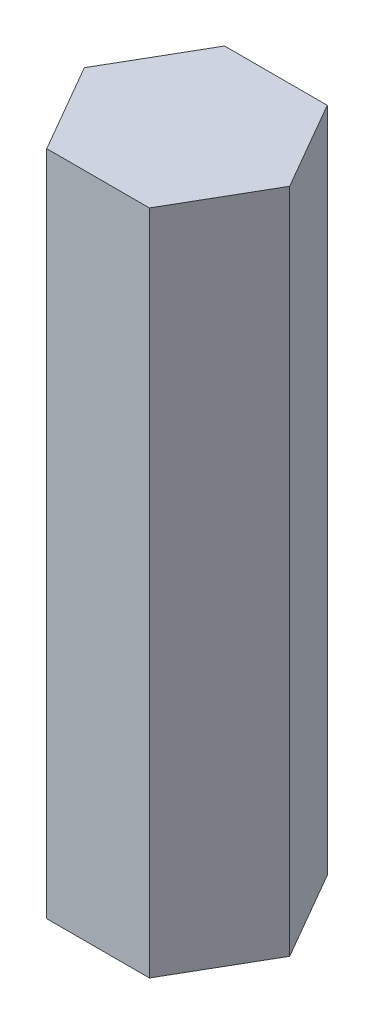
ISO-10303-21;
HEADER;
FILE_DESCRIPTION(('STEP AP214'),'2;1');
FILE_NAME('part.step','',(''),(''),'','','');
FILE_SCHEMA(('AUTOMOTIVE_DESIGN { 1 0 10303 214 1 1 1 1 }'));
ENDSEC;
DATA;
#1=APPLICATION_CONTEXT('core data for automotive mechanical design processes');
#2=APPLICATION_PROTOCOL_DEFINITION('international standard','automotive_design',2000,#1);
#3=PRODUCT_CONTEXT('',#1,'mechanical');
#4=PRODUCT('Part','Part','',(#3));
#5=PRODUCT_RELATED_PRODUCT_CATEGORY('part','',(#4));
#6=PRODUCT_DEFINITION_FORMATION('','',#4);
#7=PRODUCT_DEFINITION_CONTEXT('part definition',#1,'design');
#8=PRODUCT_DEFINITION('design','',#6,#7);
#9=PRODUCT_DEFINITION_SHAPE('','',#8);
#10=(LENGTH_UNIT() NAMED_UNIT(*) SI_UNIT(.MILLI.,.METRE.));
#11=(NAMED_UNIT(*) PLANE_ANGLE_UNIT() SI_UNIT($,.RADIAN.));
#12=(NAMED_UNIT(*) SI_UNIT($,.STERADIAN.) SOLID_ANGLE_UNIT());
#13=UNCERTAINTY_MEASURE_WITH_UNIT(LENGTH_MEASURE(1.E-05),#10,'distance_accuracy_value','');
#14=(GEOMETRIC_REPRESENTATION_CONTEXT(3) GLOBAL_UNCERTAINTY_ASSIGNED_CONTEXT((#13)) GLOBAL_UNIT_ASSIGNED_CONTEXT((#10,
#11,#12)) REPRESENTATION_CONTEXT('',''));
#15=CARTESIAN_POINT('',(0.,0.,0.));
#16=DIRECTION('',(0.,0.,1.));
#17=DIRECTION('',(1.,0.,0.));
#18=AXIS2_PLACEMENT_3D('',#15,#16,#17);
#19=CARTESIAN_POINT('',(-7.3323484187084,47.625,-12.6999999999999));
#20=DIRECTION('',(0.866025403784441,0.,0.499999999999995));
#21=DIRECTION('',(0.499999999999995,0.,-0.866025403784442));
#22=AXIS2_PLACEMENT_3D('',#19,#20,#21);
#23=PLANE('',#22);
#24=DIRECTION('',(-0.499999999999995,0.,0.866025403784442));
#25=VECTOR('',#24,1.);
#26=CARTESIAN_POINT('',(-7.3323484187084,-47.625,-12.6999999999999));
#27=LINE('',#26,#25);
#28=CARTESIAN_POINT('',(-7.3323484187084,-47.625,-12.6999999999999));
#29=VERTEX_POINT('',#28);
#30=CARTESIAN_POINT('',(-14.6646968374165,-47.625,0.));
#31=VERTEX_POINT('',#30);
#32=EDGE_CURVE('E122',#29,#31,#27,.T.);
#33=ORIENTED_EDGE('',*,*,#32,.T.);
#34=DIRECTION('',(0.,-1.,0.));
#35=VECTOR('',#34,1.);
#36=CARTESIAN_POINT('',(-14.6646968374165,47.625,0.));
#37=LINE('',#36,#35);
#38=CARTESIAN_POINT('',(-14.6646968374165,47.625,0.));
#39=VERTEX_POINT('',#38);
#40=EDGE_CURVE('E11',#39,#31,#37,.T.);
#41=ORIENTED_EDGE('',*,*,#40,.F.);
#42=DIRECTION('',(-0.499999999999995,0.,0.866025403784442));
#43=VECTOR('',#42,1.);
#44=CARTESIAN_POINT('',(-7.3323484187084,47.625,-12.6999999999999));
#45=LINE('',#44,#43);
#46=CARTESIAN_POINT('',(-7.3323484187084,47.625,-12.6999999999999));
#47=VERTEX_POINT('',#46);
#48=EDGE_CURVE('E132',#47,#39,#45,.T.);
#49=ORIENTED_EDGE('',*,*,#48,.F.);
#50=DIRECTION('',(0.,-1.,0.));
#51=VECTOR('',#50,1.);
#52=CARTESIAN_POINT('',(-7.3323484187084,47.625,-12.6999999999999));
#53=LINE('',#52,#51);
#54=EDGE_CURVE('E118',#47,#29,#53,.T.);
#55=ORIENTED_EDGE('',*,*,#54,.T.);
#56=EDGE_LOOP('',(#33,#41,#49,#55));
#57=FACE_BOUND('',#56,.T.);
#58=ADVANCED_FACE('F38',(#57),#23,.F.);
#59=CARTESIAN_POINT('',(-14.6646968374165,47.625,0.));
#60=DIRECTION('',(0.866025403784438,0.,-0.500000000000001));
#61=DIRECTION('',(-0.500000000000001,0.,-0.866025403784438));
#62=AXIS2_PLACEMENT_3D('',#59,#60,#61);
#63=PLANE('',#62);
#64=DIRECTION('',(0.500000000000001,0.,0.866025403784438));
#65=VECTOR('',#64,1.);
#66=CARTESIAN_POINT('',(-14.6646968374165,-47.625,0.));
#67=LINE('',#66,#65);
#68=CARTESIAN_POINT('',(-7.33234841870822,-47.625,12.7));
#69=VERTEX_POINT('',#68);
#70=EDGE_CURVE('E125',#31,#69,#67,.T.);
#71=ORIENTED_EDGE('',*,*,#70,.T.);
#72=DIRECTION('',(0.,-1.,0.));
#73=VECTOR('',#72,1.);
#74=CARTESIAN_POINT('',(-7.33234841870822,47.625,12.7));
#75=LINE('',#74,#73);
#76=CARTESIAN_POINT('',(-7.33234841870822,47.625,12.7));
#77=VERTEX_POINT('',#76);
#78=EDGE_CURVE('E46',#77,#69,#75,.T.);
#79=ORIENTED_EDGE('',*,*,#78,.F.);
#80=DIRECTION('',(0.500000000000001,0.,0.866025403784438));
#81=VECTOR('',#80,1.);
#82=CARTESIAN_POINT('',(-14.6646968374165,47.625,0.));
#83=LINE('',#82,#81);
#84=EDGE_CURVE('E91',#39,#77,#83,.T.);
#85=ORIENTED_EDGE('',*,*,#84,.F.);
#86=ORIENTED_EDGE('',*,*,#40,.T.);
#87=EDGE_LOOP('',(#71,#79,#85,#86));
#88=FACE_BOUND('',#87,.T.);
#89=ADVANCED_FACE('F156',(#88),#63,.F.);
#90=CARTESIAN_POINT('',(-7.33234841870822,47.625,12.7));
#91=DIRECTION('',(0.,0.,-1.));
#92=DIRECTION('',(-1.,0.,0.));
#93=AXIS2_PLACEMENT_3D('',#90,#91,#92);
#94=PLANE('',#93);
#95=DIRECTION('',(1.,0.,0.));
#96=VECTOR('',#95,1.);
#97=CARTESIAN_POINT('',(-7.33234841870822,-47.625,12.7));
#98=LINE('',#97,#96);
#99=CARTESIAN_POINT('',(7.33234841870831,-47.625,12.7));
#100=VERTEX_POINT('',#99);
#101=EDGE_CURVE('E127',#69,#100,#98,.T.);
#102=ORIENTED_EDGE('',*,*,#101,.T.);
#103=DIRECTION('',(0.,-1.,0.));
#104=VECTOR('',#103,1.);
#105=CARTESIAN_POINT('',(7.33234841870831,47.625,12.7));
#106=LINE('',#105,#104);
#107=CARTESIAN_POINT('',(7.33234841870831,47.625,12.7));
#108=VERTEX_POINT('',#107);
#109=EDGE_CURVE('E113',#108,#100,#106,.T.);
#110=ORIENTED_EDGE('',*,*,#109,.F.);
#111=DIRECTION('',(1.,0.,0.));
#112=VECTOR('',#111,1.);
#113=CARTESIAN_POINT('',(-7.33234841870822,47.625,12.7));
#114=LINE('',#113,#112);
#115=EDGE_CURVE('E104',#77,#108,#114,.T.);
#116=ORIENTED_EDGE('',*,*,#115,.F.);
#117=ORIENTED_EDGE('',*,*,#78,.T.);
#118=EDGE_LOOP('',(#102,#110,#116,#117));
#119=FACE_BOUND('',#118,.T.);
#120=ADVANCED_FACE('F138',(#119),#94,.F.);
#121=CARTESIAN_POINT('',(7.33234841870831,47.625,12.7));
#122=DIRECTION('',(-0.866025403784442,0.,-0.499999999999995));
#123=DIRECTION('',(-0.499999999999995,0.,0.866025403784442));
#124=AXIS2_PLACEMENT_3D('',#121,#122,#123);
#125=PLANE('',#124);
#126=DIRECTION('',(0.499999999999995,0.,-0.866025403784442));
#127=VECTOR('',#126,1.);
#128=CARTESIAN_POINT('',(7.33234841870831,-47.625,12.7));
#129=LINE('',#128,#127);
#130=CARTESIAN_POINT('',(14.6646968374165,-47.625,-1.02403030695263E-13));
#131=VERTEX_POINT('',#130);
#132=EDGE_CURVE('E112',#100,#131,#129,.T.);
#133=ORIENTED_EDGE('',*,*,#132,.T.);
#134=DIRECTION('',(0.,-1.,0.));
#135=VECTOR('',#134,1.);
#136=CARTESIAN_POINT('',(14.6646968374165,47.625,-1.02403030695263E-13));
#137=LINE('',#136,#135);
#138=CARTESIAN_POINT('',(14.6646968374165,47.625,-1.02403030695263E-13));
#139=VERTEX_POINT('',#138);
#140=EDGE_CURVE('E109',#139,#131,#137,.T.);
#141=ORIENTED_EDGE('',*,*,#140,.F.);
#142=DIRECTION('',(0.499999999999995,0.,-0.866025403784442));
#143=VECTOR('',#142,1.);
#144=CARTESIAN_POINT('',(7.33234841870831,47.625,12.7));
#145=LINE('',#144,#143);
#146=EDGE_CURVE('E98',#108,#139,#145,.T.);
#147=ORIENTED_EDGE('',*,*,#146,.F.);
#148=ORIENTED_EDGE('',*,*,#109,.T.);
#149=EDGE_LOOP('',(#133,#141,#147,#148));
#150=FACE_BOUND('',#149,.T.);
#151=ADVANCED_FACE('F110',(#150),#125,.F.);
#152=CARTESIAN_POINT('',(14.6646968374165,47.625,-1.02403030695263E-13));
#153=DIRECTION('',(-0.866025403784435,0.,0.500000000000007));
#154=DIRECTION('',(0.500000000000007,0.,0.866025403784435));
#155=AXIS2_PLACEMENT_3D('',#152,#153,#154);
#156=PLANE('',#155);
#157=DIRECTION('',(-0.500000000000007,0.,-0.866025403784435));
#158=VECTOR('',#157,1.);
#159=CARTESIAN_POINT('',(14.6646968374165,-47.625,-1.02403030695263E-13));
#160=LINE('',#159,#158);
#161=CARTESIAN_POINT('',(7.33234841870813,-47.625,-12.7000000000001));
#162=VERTEX_POINT('',#161);
#163=EDGE_CURVE('E77',#131,#162,#160,.T.);
#164=ORIENTED_EDGE('',*,*,#163,.T.);
#165=DIRECTION('',(0.,-1.,0.));
#166=VECTOR('',#165,1.);
#167=CARTESIAN_POINT('',(7.33234841870813,47.625,-12.7000000000001));
#168=LINE('',#167,#166);
#169=CARTESIAN_POINT('',(7.33234841870813,47.625,-12.7000000000001));
#170=VERTEX_POINT('',#169);
#171=EDGE_CURVE('E114',#170,#162,#168,.T.);
#172=ORIENTED_EDGE('',*,*,#171,.F.);
#173=DIRECTION('',(-0.500000000000007,0.,-0.866025403784435));
#174=VECTOR('',#173,1.);
#175=CARTESIAN_POINT('',(14.6646968374165,47.625,-1.02403030695263E-13));
#176=LINE('',#175,#174);
#177=EDGE_CURVE('E102',#139,#170,#176,.T.);
#178=ORIENTED_EDGE('',*,*,#177,.F.);
#179=ORIENTED_EDGE('',*,*,#140,.T.);
#180=EDGE_LOOP('',(#164,#172,#178,#179));
#181=FACE_BOUND('',#180,.T.);
#182=ADVANCED_FACE('F116',(#181),#156,.F.);
#183=CARTESIAN_POINT('',(7.33234841870813,47.625,-12.7000000000001));
#184=DIRECTION('',(0.,0.,1.));
#185=DIRECTION('',(1.,0.,0.));
#186=AXIS2_PLACEMENT_3D('',#183,#184,#185);
#187=PLANE('',#186);
#188=DIRECTION('',(-1.,0.,0.));
#189=VECTOR('',#188,1.);
#190=CARTESIAN_POINT('',(7.33234841870813,-47.625,-12.7000000000001));
#191=LINE('',#190,#189);
#192=EDGE_CURVE('E83',#162,#29,#191,.T.);
#193=ORIENTED_EDGE('',*,*,#192,.T.);
#194=ORIENTED_EDGE('',*,*,#54,.F.);
#195=DIRECTION('',(-1.,0.,0.));
#196=VECTOR('',#195,1.);
#197=CARTESIAN_POINT('',(7.33234841870813,47.625,-12.7000000000001));
#198=LINE('',#197,#196);
#199=EDGE_CURVE('E54',#170,#47,#198,.T.);
#200=ORIENTED_EDGE('',*,*,#199,.F.);
#201=ORIENTED_EDGE('',*,*,#171,.T.);
#202=EDGE_LOOP('',(#193,#194,#200,#201));
#203=FACE_BOUND('',#202,.T.);
#204=ADVANCED_FACE('F145',(#203),#187,.F.);
#205=CARTESIAN_POINT('',(0.,47.625,0.));
#206=DIRECTION('',(0.,1.,0.));
#207=DIRECTION('',(0.,0.,1.));
#208=AXIS2_PLACEMENT_3D('',#205,#206,#207);
#209=PLANE('',#208);
#210=ORIENTED_EDGE('',*,*,#48,.T.);
#211=ORIENTED_EDGE('',*,*,#84,.T.);
#212=ORIENTED_EDGE('',*,*,#115,.T.);
#213=ORIENTED_EDGE('',*,*,#146,.T.);
#214=ORIENTED_EDGE('',*,*,#177,.T.);
#215=ORIENTED_EDGE('',*,*,#199,.T.);
#216=EDGE_LOOP('',(#210,#211,#212,#213,#214,#215));
#217=FACE_BOUND('',#216,.T.);
#218=ADVANCED_FACE('F100',(#217),#209,.T.);
#219=CARTESIAN_POINT('',(0.,-47.625,0.));
#220=DIRECTION('',(0.,1.,0.));
#221=DIRECTION('',(0.,0.,1.));
#222=AXIS2_PLACEMENT_3D('',#219,#220,#221);
#223=PLANE('',#222);
#224=ORIENTED_EDGE('',*,*,#32,.F.);
#225=ORIENTED_EDGE('',*,*,#192,.F.);
#226=ORIENTED_EDGE('',*,*,#163,.F.);
#227=ORIENTED_EDGE('',*,*,#132,.F.);
#228=ORIENTED_EDGE('',*,*,#101,.F.);
#229=ORIENTED_EDGE('',*,*,#70,.F.);
#230=EDGE_LOOP('',(#224,#225,#226,#227,#228,#229));
#231=FACE_BOUND('',#230,.T.);
#232=ADVANCED_FACE('F141',(#231),#223,.F.);
#233=CLOSED_SHELL('',(#58,#89,#120,#151,#182,#204,#218,#232));
#234=MANIFOLD_SOLID_BREP('B2',#233);
#235=ADVANCED_BREP_SHAPE_REPRESENTATION('',(#18,#234),#14);
#236=SHAPE_DEFINITION_REPRESENTATION(#9,#235);
ENDSEC;
END-ISO-10303-21;
